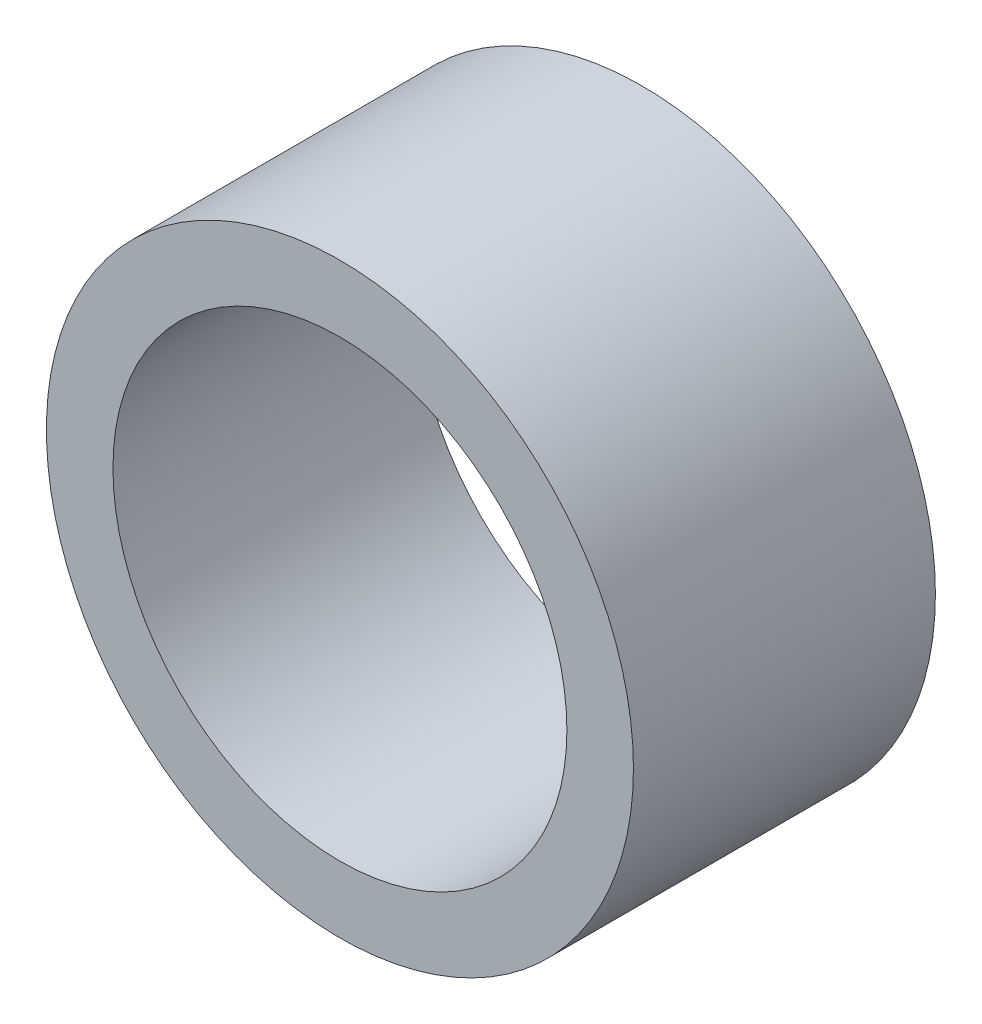
ISO-10303-21;
HEADER;
FILE_DESCRIPTION(('STEP AP214'),'2;1');
FILE_NAME('part.step','',(''),(''),'','','');
FILE_SCHEMA(('AUTOMOTIVE_DESIGN { 1 0 10303 214 1 1 1 1 }'));
ENDSEC;
DATA;
#1=APPLICATION_CONTEXT('core data for automotive mechanical design processes');
#2=APPLICATION_PROTOCOL_DEFINITION('international standard','automotive_design',2000,#1);
#3=PRODUCT_CONTEXT('',#1,'mechanical');
#4=PRODUCT('Part','Part','',(#3));
#5=PRODUCT_RELATED_PRODUCT_CATEGORY('part','',(#4));
#6=PRODUCT_DEFINITION_FORMATION('','',#4);
#7=PRODUCT_DEFINITION_CONTEXT('part definition',#1,'design');
#8=PRODUCT_DEFINITION('design','',#6,#7);
#9=PRODUCT_DEFINITION_SHAPE('','',#8);
#10=(LENGTH_UNIT() NAMED_UNIT(*) SI_UNIT(.MILLI.,.METRE.));
#11=(NAMED_UNIT(*) PLANE_ANGLE_UNIT() SI_UNIT($,.RADIAN.));
#12=(NAMED_UNIT(*) SI_UNIT($,.STERADIAN.) SOLID_ANGLE_UNIT());
#13=UNCERTAINTY_MEASURE_WITH_UNIT(LENGTH_MEASURE(1.E-05),#10,'distance_accuracy_value','');
#14=(GEOMETRIC_REPRESENTATION_CONTEXT(3) GLOBAL_UNCERTAINTY_ASSIGNED_CONTEXT((#13)) GLOBAL_UNIT_ASSIGNED_CONTEXT((#10,
#11,#12)) REPRESENTATION_CONTEXT('',''));
#15=CARTESIAN_POINT('',(0.,0.,0.));
#16=DIRECTION('',(0.,0.,1.));
#17=DIRECTION('',(1.,0.,0.));
#18=AXIS2_PLACEMENT_3D('',#15,#16,#17);
#19=CARTESIAN_POINT('',(0.,0.,4.89987844));
#20=DIRECTION('',(0.,0.,1.));
#21=DIRECTION('',(1.,0.,0.));
#22=AXIS2_PLACEMENT_3D('',#19,#20,#21);
#23=PLANE('',#22);
#24=CARTESIAN_POINT('',(0.,0.,4.89987844));
#25=DIRECTION('',(0.,0.,1.));
#26=DIRECTION('',(1.,0.,0.));
#27=AXIS2_PLACEMENT_3D('',#24,#25,#26);
#28=CIRCLE('',#27,9.525);
#29=CARTESIAN_POINT('',(9.525,0.,4.89987844));
#30=VERTEX_POINT('',#29);
#31=EDGE_CURVE('E10',#30,#30,#28,.T.);
#32=ORIENTED_EDGE('',*,*,#31,.T.);
#33=EDGE_LOOP('',(#32));
#34=FACE_BOUND('',#33,.T.);
#35=CARTESIAN_POINT('',(0.,0.,4.89987844));
#36=DIRECTION('',(0.,0.,1.));
#37=DIRECTION('',(1.,0.,0.));
#38=AXIS2_PLACEMENT_3D('',#35,#36,#37);
#39=CIRCLE('',#38,7.366);
#40=CARTESIAN_POINT('',(7.366,0.,4.89987844));
#41=VERTEX_POINT('',#40);
#42=EDGE_CURVE('E54',#41,#41,#39,.T.);
#43=ORIENTED_EDGE('',*,*,#42,.F.);
#44=EDGE_LOOP('',(#43));
#45=FACE_BOUND('',#44,.T.);
#46=ADVANCED_FACE('F41',(#34,#45),#23,.T.);
#47=CARTESIAN_POINT('',(0.,0.,-4.89987844));
#48=DIRECTION('',(0.,0.,1.));
#49=DIRECTION('',(1.,0.,0.));
#50=AXIS2_PLACEMENT_3D('',#47,#48,#49);
#51=PLANE('',#50);
#52=CARTESIAN_POINT('',(0.,0.,-4.89987844));
#53=DIRECTION('',(0.,0.,1.));
#54=DIRECTION('',(1.,0.,0.));
#55=AXIS2_PLACEMENT_3D('',#52,#53,#54);
#56=CIRCLE('',#55,9.525);
#57=CARTESIAN_POINT('',(9.525,0.,-4.89987844));
#58=VERTEX_POINT('',#57);
#59=EDGE_CURVE('E45',#58,#58,#56,.T.);
#60=ORIENTED_EDGE('',*,*,#59,.F.);
#61=EDGE_LOOP('',(#60));
#62=FACE_BOUND('',#61,.T.);
#63=CARTESIAN_POINT('',(0.,0.,-4.89987844));
#64=DIRECTION('',(0.,0.,1.));
#65=DIRECTION('',(1.,0.,0.));
#66=AXIS2_PLACEMENT_3D('',#63,#64,#65);
#67=CIRCLE('',#66,7.366);
#68=CARTESIAN_POINT('',(7.366,0.,-4.89987844));
#69=VERTEX_POINT('',#68);
#70=EDGE_CURVE('E56',#69,#69,#67,.T.);
#71=ORIENTED_EDGE('',*,*,#70,.T.);
#72=EDGE_LOOP('',(#71));
#73=FACE_BOUND('',#72,.T.);
#74=ADVANCED_FACE('F68',(#62,#73),#51,.F.);
#75=CARTESIAN_POINT('',(0.,0.,4.89987844));
#76=DIRECTION('',(0.,0.,-1.));
#77=DIRECTION('',(-1.,0.,0.));
#78=AXIS2_PLACEMENT_3D('',#75,#76,#77);
#79=CYLINDRICAL_SURFACE('',#78,9.525);
#80=ORIENTED_EDGE('',*,*,#31,.F.);
#81=EDGE_LOOP('',(#80));
#82=FACE_BOUND('',#81,.T.);
#83=ORIENTED_EDGE('',*,*,#59,.T.);
#84=EDGE_LOOP('',(#83));
#85=FACE_BOUND('',#84,.T.);
#86=ADVANCED_FACE('F43',(#82,#85),#79,.T.);
#87=CARTESIAN_POINT('',(0.,0.,4.89987844));
#88=DIRECTION('',(0.,0.,-1.));
#89=DIRECTION('',(-1.,0.,0.));
#90=AXIS2_PLACEMENT_3D('',#87,#88,#89);
#91=CYLINDRICAL_SURFACE('',#90,7.366);
#92=ORIENTED_EDGE('',*,*,#42,.T.);
#93=EDGE_LOOP('',(#92));
#94=FACE_BOUND('',#93,.T.);
#95=ORIENTED_EDGE('',*,*,#70,.F.);
#96=EDGE_LOOP('',(#95));
#97=FACE_BOUND('',#96,.T.);
#98=ADVANCED_FACE('F64',(#94,#97),#91,.F.);
#99=CLOSED_SHELL('',(#46,#74,#86,#98));
#100=MANIFOLD_SOLID_BREP('B2',#99);
#101=ADVANCED_BREP_SHAPE_REPRESENTATION('',(#18,#100),#14);
#102=SHAPE_DEFINITION_REPRESENTATION(#9,#101);
ENDSEC;
END-ISO-10303-21;
